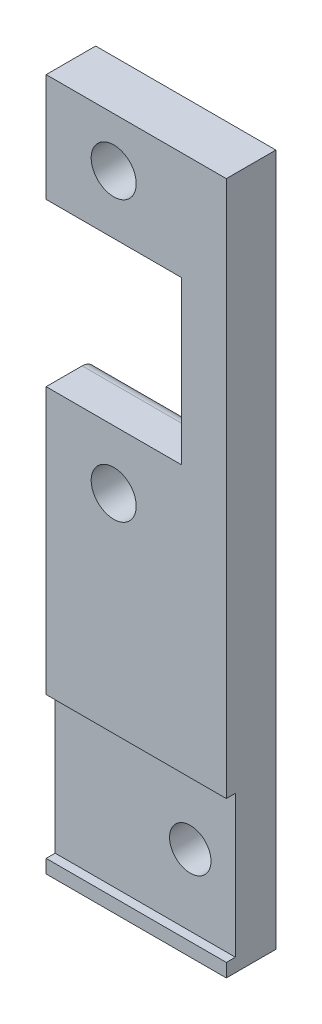
ISO-10303-21;
HEADER;
FILE_DESCRIPTION(('STEP AP214'),'2;1');
FILE_NAME('part.step','',(''),(''),'','','');
FILE_SCHEMA(('AUTOMOTIVE_DESIGN { 1 0 10303 214 1 1 1 1 }'));
ENDSEC;
DATA;
#1=APPLICATION_CONTEXT('core data for automotive mechanical design processes');
#2=APPLICATION_PROTOCOL_DEFINITION('international standard','automotive_design',2000,#1);
#3=PRODUCT_CONTEXT('',#1,'mechanical');
#4=PRODUCT('Part','Part','',(#3));
#5=PRODUCT_RELATED_PRODUCT_CATEGORY('part','',(#4));
#6=PRODUCT_DEFINITION_FORMATION('','',#4);
#7=PRODUCT_DEFINITION_CONTEXT('part definition',#1,'design');
#8=PRODUCT_DEFINITION('design','',#6,#7);
#9=PRODUCT_DEFINITION_SHAPE('','',#8);
#10=(LENGTH_UNIT() NAMED_UNIT(*) SI_UNIT(.MILLI.,.METRE.));
#11=(NAMED_UNIT(*) PLANE_ANGLE_UNIT() SI_UNIT($,.RADIAN.));
#12=(NAMED_UNIT(*) SI_UNIT($,.STERADIAN.) SOLID_ANGLE_UNIT());
#13=UNCERTAINTY_MEASURE_WITH_UNIT(LENGTH_MEASURE(1.E-05),#10,'distance_accuracy_value','');
#14=(GEOMETRIC_REPRESENTATION_CONTEXT(3) GLOBAL_UNCERTAINTY_ASSIGNED_CONTEXT((#13)) GLOBAL_UNIT_ASSIGNED_CONTEXT((#10,
#11,#12)) REPRESENTATION_CONTEXT('',''));
#15=CARTESIAN_POINT('',(0.,0.,0.));
#16=DIRECTION('',(0.,0.,1.));
#17=DIRECTION('',(1.,0.,0.));
#18=AXIS2_PLACEMENT_3D('',#15,#16,#17);
#19=CARTESIAN_POINT('',(0.,0.,5.5));
#20=DIRECTION('',(0.,0.,-1.));
#21=DIRECTION('',(-1.,0.,0.));
#22=AXIS2_PLACEMENT_3D('',#19,#20,#21);
#23=PLANE('',#22);
#24=CARTESIAN_POINT('',(7.5,71.35,5.5));
#25=DIRECTION('',(0.,0.,1.));
#26=DIRECTION('',(1.,0.,0.));
#27=AXIS2_PLACEMENT_3D('',#24,#25,#26);
#28=CIRCLE('',#27,2.5);
#29=CARTESIAN_POINT('',(10.,71.35,5.5));
#30=VERTEX_POINT('',#29);
#31=EDGE_CURVE('E175',#30,#30,#28,.T.);
#32=ORIENTED_EDGE('',*,*,#31,.F.);
#33=EDGE_LOOP('',(#32));
#34=FACE_BOUND('',#33,.T.);
#35=CARTESIAN_POINT('',(7.5,40.35,5.5));
#36=DIRECTION('',(0.,0.,1.));
#37=DIRECTION('',(1.,0.,0.));
#38=AXIS2_PLACEMENT_3D('',#35,#36,#37);
#39=CIRCLE('',#38,2.5);
#40=CARTESIAN_POINT('',(10.,40.35,5.5));
#41=VERTEX_POINT('',#40);
#42=EDGE_CURVE('E181',#41,#41,#39,.T.);
#43=ORIENTED_EDGE('',*,*,#42,.F.);
#44=EDGE_LOOP('',(#43));
#45=FACE_BOUND('',#44,.T.);
#46=DIRECTION('',(0.,-1.,0.));
#47=VECTOR('',#46,1.);
#48=CARTESIAN_POINT('',(0.,0.,5.5));
#49=LINE('',#48,#47);
#50=CARTESIAN_POINT('',(0.,46.85,5.5));
#51=VERTEX_POINT('',#50);
#52=CARTESIAN_POINT('',(0.,17.25,5.5));
#53=VERTEX_POINT('',#52);
#54=EDGE_CURVE('E187',#51,#53,#49,.T.);
#55=ORIENTED_EDGE('',*,*,#54,.T.);
#56=DIRECTION('',(-1.,0.,0.));
#57=VECTOR('',#56,1.);
#58=CARTESIAN_POINT('',(0.,17.25,5.5));
#59=LINE('',#58,#57);
#60=CARTESIAN_POINT('',(20.,17.25,5.5));
#61=VERTEX_POINT('',#60);
#62=EDGE_CURVE('E159',#61,#53,#59,.T.);
#63=ORIENTED_EDGE('',*,*,#62,.F.);
#64=DIRECTION('',(0.,1.,0.));
#65=VECTOR('',#64,1.);
#66=CARTESIAN_POINT('',(20.,0.,5.5));
#67=LINE('',#66,#65);
#68=CARTESIAN_POINT('',(20.,76.85,5.5));
#69=VERTEX_POINT('',#68);
#70=EDGE_CURVE('E192',#61,#69,#67,.T.);
#71=ORIENTED_EDGE('',*,*,#70,.T.);
#72=DIRECTION('',(-1.,0.,0.));
#73=VECTOR('',#72,1.);
#74=CARTESIAN_POINT('',(0.,76.85,5.5));
#75=LINE('',#74,#73);
#76=CARTESIAN_POINT('',(0.,76.85,5.5));
#77=VERTEX_POINT('',#76);
#78=EDGE_CURVE('E196',#69,#77,#75,.T.);
#79=ORIENTED_EDGE('',*,*,#78,.T.);
#80=DIRECTION('',(0.,-1.,0.));
#81=VECTOR('',#80,1.);
#82=CARTESIAN_POINT('',(0.,64.85,5.5));
#83=LINE('',#82,#81);
#84=CARTESIAN_POINT('',(0.,64.85,5.5));
#85=VERTEX_POINT('',#84);
#86=EDGE_CURVE('E198',#77,#85,#83,.T.);
#87=ORIENTED_EDGE('',*,*,#86,.T.);
#88=DIRECTION('',(1.,0.,0.));
#89=VECTOR('',#88,1.);
#90=CARTESIAN_POINT('',(15.,64.85,5.5));
#91=LINE('',#90,#89);
#92=CARTESIAN_POINT('',(15.,64.85,5.5));
#93=VERTEX_POINT('',#92);
#94=EDGE_CURVE('E200',#85,#93,#91,.T.);
#95=ORIENTED_EDGE('',*,*,#94,.T.);
#96=DIRECTION('',(0.,-1.,0.));
#97=VECTOR('',#96,1.);
#98=CARTESIAN_POINT('',(15.,46.85,5.5));
#99=LINE('',#98,#97);
#100=CARTESIAN_POINT('',(15.,46.85,5.5));
#101=VERTEX_POINT('',#100);
#102=EDGE_CURVE('E202',#93,#101,#99,.T.);
#103=ORIENTED_EDGE('',*,*,#102,.T.);
#104=DIRECTION('',(-1.,0.,0.));
#105=VECTOR('',#104,1.);
#106=CARTESIAN_POINT('',(0.,46.85,5.5));
#107=LINE('',#106,#105);
#108=EDGE_CURVE('E204',#101,#51,#107,.T.);
#109=ORIENTED_EDGE('',*,*,#108,.T.);
#110=EDGE_LOOP('',(#55,#63,#71,#79,#87,#95,#103,#109));
#111=FACE_BOUND('',#110,.T.);
#112=ADVANCED_FACE('F40',(#34,#45,#111),#23,.F.);
#113=CARTESIAN_POINT('',(20.,0.,5.5));
#114=VERTEX_POINT('',#113);
#115=CARTESIAN_POINT('',(20.,1.5,5.5));
#116=VERTEX_POINT('',#115);
#117=EDGE_CURVE('E193',#114,#116,#67,.T.);
#118=ORIENTED_EDGE('',*,*,#117,.T.);
#119=DIRECTION('',(1.,0.,0.));
#120=VECTOR('',#119,1.);
#121=CARTESIAN_POINT('',(0.,1.5,5.5));
#122=LINE('',#121,#120);
#123=CARTESIAN_POINT('',(0.,1.5,5.5));
#124=VERTEX_POINT('',#123);
#125=EDGE_CURVE('E282',#124,#116,#122,.T.);
#126=ORIENTED_EDGE('',*,*,#125,.F.);
#127=CARTESIAN_POINT('',(0.,0.,5.5));
#128=VERTEX_POINT('',#127);
#129=EDGE_CURVE('E164',#124,#128,#49,.T.);
#130=ORIENTED_EDGE('',*,*,#129,.T.);
#131=DIRECTION('',(1.,0.,0.));
#132=VECTOR('',#131,1.);
#133=CARTESIAN_POINT('',(0.,0.,5.5));
#134=LINE('',#133,#132);
#135=EDGE_CURVE('E190',#128,#114,#134,.T.);
#136=ORIENTED_EDGE('',*,*,#135,.T.);
#137=EDGE_LOOP('',(#118,#126,#130,#136));
#138=FACE_BOUND('',#137,.T.);
#139=ADVANCED_FACE('F281',(#138),#23,.F.);
#140=CARTESIAN_POINT('',(0.,0.,0.));
#141=DIRECTION('',(0.,0.,-1.));
#142=DIRECTION('',(-1.,0.,0.));
#143=AXIS2_PLACEMENT_3D('',#140,#141,#142);
#144=PLANE('',#143);
#145=CARTESIAN_POINT('',(7.5,71.35,0.));
#146=DIRECTION('',(0.,0.,1.));
#147=DIRECTION('',(1.,0.,0.));
#148=AXIS2_PLACEMENT_3D('',#145,#146,#147);
#149=CIRCLE('',#148,2.5);
#150=CARTESIAN_POINT('',(10.,71.35,0.));
#151=VERTEX_POINT('',#150);
#152=EDGE_CURVE('E174',#151,#151,#149,.T.);
#153=ORIENTED_EDGE('',*,*,#152,.T.);
#154=EDGE_LOOP('',(#153));
#155=FACE_BOUND('',#154,.T.);
#156=DIRECTION('',(0.,-1.,0.));
#157=VECTOR('',#156,1.);
#158=CARTESIAN_POINT('',(0.,0.,0.));
#159=LINE('',#158,#157);
#160=CARTESIAN_POINT('',(0.,45.35,0.));
#161=VERTEX_POINT('',#160);
#162=CARTESIAN_POINT('',(0.,0.,0.));
#163=VERTEX_POINT('',#162);
#164=EDGE_CURVE('E184',#161,#163,#159,.T.);
#165=ORIENTED_EDGE('',*,*,#164,.F.);
#166=DIRECTION('',(-1.,0.,0.));
#167=VECTOR('',#166,1.);
#168=CARTESIAN_POINT('',(15.,45.35,0.));
#169=LINE('',#168,#167);
#170=CARTESIAN_POINT('',(15.,45.35,0.));
#171=VERTEX_POINT('',#170);
#172=EDGE_CURVE('E247',#161,#171,#169,.F.);
#173=ORIENTED_EDGE('',*,*,#172,.T.);
#174=DIRECTION('',(0.,-1.,0.));
#175=VECTOR('',#174,1.);
#176=CARTESIAN_POINT('',(15.,46.85,0.));
#177=LINE('',#176,#175);
#178=CARTESIAN_POINT('',(15.,66.35,0.));
#179=VERTEX_POINT('',#178);
#180=EDGE_CURVE('E216',#179,#171,#177,.T.);
#181=ORIENTED_EDGE('',*,*,#180,.F.);
#182=DIRECTION('',(1.,0.,0.));
#183=VECTOR('',#182,1.);
#184=CARTESIAN_POINT('',(0.,66.35,0.));
#185=LINE('',#184,#183);
#186=CARTESIAN_POINT('',(0.,66.35,0.));
#187=VERTEX_POINT('',#186);
#188=EDGE_CURVE('E245',#179,#187,#185,.F.);
#189=ORIENTED_EDGE('',*,*,#188,.T.);
#190=DIRECTION('',(0.,-1.,0.));
#191=VECTOR('',#190,1.);
#192=CARTESIAN_POINT('',(0.,64.85,0.));
#193=LINE('',#192,#191);
#194=CARTESIAN_POINT('',(0.,76.85,0.));
#195=VERTEX_POINT('',#194);
#196=EDGE_CURVE('E214',#195,#187,#193,.T.);
#197=ORIENTED_EDGE('',*,*,#196,.F.);
#198=DIRECTION('',(-1.,0.,0.));
#199=VECTOR('',#198,1.);
#200=CARTESIAN_POINT('',(0.,76.85,0.));
#201=LINE('',#200,#199);
#202=CARTESIAN_POINT('',(20.,76.85,0.));
#203=VERTEX_POINT('',#202);
#204=EDGE_CURVE('E212',#203,#195,#201,.T.);
#205=ORIENTED_EDGE('',*,*,#204,.F.);
#206=DIRECTION('',(0.,1.,0.));
#207=VECTOR('',#206,1.);
#208=CARTESIAN_POINT('',(20.,0.,0.));
#209=LINE('',#208,#207);
#210=CARTESIAN_POINT('',(20.,0.,0.));
#211=VERTEX_POINT('',#210);
#212=EDGE_CURVE('E210',#211,#203,#209,.T.);
#213=ORIENTED_EDGE('',*,*,#212,.F.);
#214=DIRECTION('',(1.,0.,0.));
#215=VECTOR('',#214,1.);
#216=CARTESIAN_POINT('',(0.,0.,0.));
#217=LINE('',#216,#215);
#218=EDGE_CURVE('E208',#163,#211,#217,.T.);
#219=ORIENTED_EDGE('',*,*,#218,.F.);
#220=EDGE_LOOP('',(#165,#173,#181,#189,#197,#205,#213,#219));
#221=FACE_BOUND('',#220,.T.);
#222=CARTESIAN_POINT('',(7.5,40.35,0.));
#223=DIRECTION('',(0.,0.,1.));
#224=DIRECTION('',(1.,0.,0.));
#225=AXIS2_PLACEMENT_3D('',#222,#223,#224);
#226=CIRCLE('',#225,2.5);
#227=CARTESIAN_POINT('',(10.,40.35,0.));
#228=VERTEX_POINT('',#227);
#229=EDGE_CURVE('E178',#228,#228,#226,.T.);
#230=ORIENTED_EDGE('',*,*,#229,.T.);
#231=EDGE_LOOP('',(#230));
#232=FACE_BOUND('',#231,.T.);
#233=CARTESIAN_POINT('',(15.,9.375,0.));
#234=DIRECTION('',(0.,0.,1.));
#235=DIRECTION('',(1.,0.,0.));
#236=AXIS2_PLACEMENT_3D('',#233,#234,#235);
#237=CIRCLE('',#236,2.3);
#238=CARTESIAN_POINT('',(17.3,9.375,0.));
#239=VERTEX_POINT('',#238);
#240=EDGE_CURVE('E171',#239,#239,#237,.T.);
#241=ORIENTED_EDGE('',*,*,#240,.T.);
#242=EDGE_LOOP('',(#241));
#243=FACE_BOUND('',#242,.T.);
#244=ADVANCED_FACE('F271',(#155,#221,#232,#243),#144,.T.);
#245=CARTESIAN_POINT('',(0.,0.,5.5));
#246=DIRECTION('',(1.,0.,0.));
#247=DIRECTION('',(0.,0.,-1.));
#248=AXIS2_PLACEMENT_3D('',#245,#246,#247);
#249=PLANE('',#248);
#250=DIRECTION('',(0.,-1.,0.));
#251=VECTOR('',#250,1.);
#252=CARTESIAN_POINT('',(0.,1.5,4.5));
#253=LINE('',#252,#251);
#254=CARTESIAN_POINT('',(0.,17.25,4.5));
#255=VERTEX_POINT('',#254);
#256=CARTESIAN_POINT('',(0.,1.5,4.5));
#257=VERTEX_POINT('',#256);
#258=EDGE_CURVE('E150',#255,#257,#253,.T.);
#259=ORIENTED_EDGE('',*,*,#258,.F.);
#260=DIRECTION('',(0.,0.,1.));
#261=VECTOR('',#260,1.);
#262=CARTESIAN_POINT('',(0.,17.25,4.5));
#263=LINE('',#262,#261);
#264=EDGE_CURVE('E287',#255,#53,#263,.T.);
#265=ORIENTED_EDGE('',*,*,#264,.T.);
#266=ORIENTED_EDGE('',*,*,#54,.F.);
#267=DIRECTION('',(0.,0.,-1.));
#268=VECTOR('',#267,1.);
#269=CARTESIAN_POINT('',(0.,46.85,5.5));
#270=LINE('',#269,#268);
#271=CARTESIAN_POINT('',(0.,46.85,1.5));
#272=VERTEX_POINT('',#271);
#273=EDGE_CURVE('E206',#51,#272,#270,.T.);
#274=ORIENTED_EDGE('',*,*,#273,.T.);
#275=CARTESIAN_POINT('',(0.,45.35,1.5));
#276=DIRECTION('',(1.,0.,0.));
#277=DIRECTION('',(0.,0.,-1.));
#278=AXIS2_PLACEMENT_3D('',#275,#276,#277);
#279=CIRCLE('',#278,1.5);
#280=EDGE_CURVE('E243',#272,#161,#279,.F.);
#281=ORIENTED_EDGE('',*,*,#280,.T.);
#282=ORIENTED_EDGE('',*,*,#164,.T.);
#283=DIRECTION('',(0.,0.,-1.));
#284=VECTOR('',#283,1.);
#285=CARTESIAN_POINT('',(0.,0.,5.5));
#286=LINE('',#285,#284);
#287=EDGE_CURVE('E237',#128,#163,#286,.T.);
#288=ORIENTED_EDGE('',*,*,#287,.F.);
#289=ORIENTED_EDGE('',*,*,#129,.F.);
#290=DIRECTION('',(0.,0.,1.));
#291=VECTOR('',#290,1.);
#292=CARTESIAN_POINT('',(0.,1.5,4.5));
#293=LINE('',#292,#291);
#294=EDGE_CURVE('E144',#257,#124,#293,.T.);
#295=ORIENTED_EDGE('',*,*,#294,.F.);
#296=EDGE_LOOP('',(#259,#265,#266,#274,#281,#282,#288,#289,#295));
#297=FACE_BOUND('',#296,.T.);
#298=ADVANCED_FACE('F162',(#297),#249,.F.);
#299=CARTESIAN_POINT('',(0.,0.,5.5));
#300=DIRECTION('',(0.,1.,0.));
#301=DIRECTION('',(0.,0.,1.));
#302=AXIS2_PLACEMENT_3D('',#299,#300,#301);
#303=PLANE('',#302);
#304=ORIENTED_EDGE('',*,*,#218,.T.);
#305=DIRECTION('',(0.,0.,-1.));
#306=VECTOR('',#305,1.);
#307=CARTESIAN_POINT('',(20.,0.,5.5));
#308=LINE('',#307,#306);
#309=EDGE_CURVE('E234',#114,#211,#308,.T.);
#310=ORIENTED_EDGE('',*,*,#309,.F.);
#311=ORIENTED_EDGE('',*,*,#135,.F.);
#312=ORIENTED_EDGE('',*,*,#287,.T.);
#313=EDGE_LOOP('',(#304,#310,#311,#312));
#314=FACE_BOUND('',#313,.T.);
#315=ADVANCED_FACE('F278',(#314),#303,.F.);
#316=CARTESIAN_POINT('',(20.,0.,5.5));
#317=DIRECTION('',(-1.,0.,0.));
#318=DIRECTION('',(0.,0.,1.));
#319=AXIS2_PLACEMENT_3D('',#316,#317,#318);
#320=PLANE('',#319);
#321=ORIENTED_EDGE('',*,*,#70,.F.);
#322=DIRECTION('',(0.,0.,1.));
#323=VECTOR('',#322,1.);
#324=CARTESIAN_POINT('',(20.,17.25,4.5));
#325=LINE('',#324,#323);
#326=CARTESIAN_POINT('',(20.,17.25,4.5));
#327=VERTEX_POINT('',#326);
#328=EDGE_CURVE('E166',#327,#61,#325,.T.);
#329=ORIENTED_EDGE('',*,*,#328,.F.);
#330=DIRECTION('',(0.,1.,0.));
#331=VECTOR('',#330,1.);
#332=CARTESIAN_POINT('',(20.,1.5,4.5));
#333=LINE('',#332,#331);
#334=CARTESIAN_POINT('',(20.,1.5,4.5));
#335=VERTEX_POINT('',#334);
#336=EDGE_CURVE('E149',#335,#327,#333,.T.);
#337=ORIENTED_EDGE('',*,*,#336,.F.);
#338=DIRECTION('',(0.,0.,1.));
#339=VECTOR('',#338,1.);
#340=CARTESIAN_POINT('',(20.,1.5,4.5));
#341=LINE('',#340,#339);
#342=EDGE_CURVE('E147',#335,#116,#341,.T.);
#343=ORIENTED_EDGE('',*,*,#342,.T.);
#344=ORIENTED_EDGE('',*,*,#117,.F.);
#345=ORIENTED_EDGE('',*,*,#309,.T.);
#346=ORIENTED_EDGE('',*,*,#212,.T.);
#347=DIRECTION('',(0.,0.,-1.));
#348=VECTOR('',#347,1.);
#349=CARTESIAN_POINT('',(20.,76.85,5.5));
#350=LINE('',#349,#348);
#351=EDGE_CURVE('E231',#69,#203,#350,.T.);
#352=ORIENTED_EDGE('',*,*,#351,.F.);
#353=EDGE_LOOP('',(#321,#329,#337,#343,#344,#345,#346,#352));
#354=FACE_BOUND('',#353,.T.);
#355=ADVANCED_FACE('F296',(#354),#320,.F.);
#356=CARTESIAN_POINT('',(0.,76.85,5.5));
#357=DIRECTION('',(0.,-1.,0.));
#358=DIRECTION('',(0.,0.,-1.));
#359=AXIS2_PLACEMENT_3D('',#356,#357,#358);
#360=PLANE('',#359);
#361=ORIENTED_EDGE('',*,*,#204,.T.);
#362=DIRECTION('',(0.,0.,-1.));
#363=VECTOR('',#362,1.);
#364=CARTESIAN_POINT('',(0.,76.85,5.5));
#365=LINE('',#364,#363);
#366=EDGE_CURVE('E228',#77,#195,#365,.T.);
#367=ORIENTED_EDGE('',*,*,#366,.F.);
#368=ORIENTED_EDGE('',*,*,#78,.F.);
#369=ORIENTED_EDGE('',*,*,#351,.T.);
#370=EDGE_LOOP('',(#361,#367,#368,#369));
#371=FACE_BOUND('',#370,.T.);
#372=ADVANCED_FACE('F300',(#371),#360,.F.);
#373=CARTESIAN_POINT('',(0.,64.85,5.5));
#374=DIRECTION('',(1.,0.,0.));
#375=DIRECTION('',(0.,0.,-1.));
#376=AXIS2_PLACEMENT_3D('',#373,#374,#375);
#377=PLANE('',#376);
#378=ORIENTED_EDGE('',*,*,#196,.T.);
#379=CARTESIAN_POINT('',(0.,66.35,1.5));
#380=DIRECTION('',(1.,0.,0.));
#381=DIRECTION('',(0.,0.,-1.));
#382=AXIS2_PLACEMENT_3D('',#379,#380,#381);
#383=CIRCLE('',#382,1.5);
#384=CARTESIAN_POINT('',(0.,64.85,1.5));
#385=VERTEX_POINT('',#384);
#386=EDGE_CURVE('E64',#187,#385,#383,.F.);
#387=ORIENTED_EDGE('',*,*,#386,.T.);
#388=DIRECTION('',(0.,0.,-1.));
#389=VECTOR('',#388,1.);
#390=CARTESIAN_POINT('',(0.,64.85,5.5));
#391=LINE('',#390,#389);
#392=EDGE_CURVE('E226',#85,#385,#391,.T.);
#393=ORIENTED_EDGE('',*,*,#392,.F.);
#394=ORIENTED_EDGE('',*,*,#86,.F.);
#395=ORIENTED_EDGE('',*,*,#366,.T.);
#396=EDGE_LOOP('',(#378,#387,#393,#394,#395));
#397=FACE_BOUND('',#396,.T.);
#398=ADVANCED_FACE('F304',(#397),#377,.F.);
#399=CARTESIAN_POINT('',(15.,64.85,5.5));
#400=DIRECTION('',(0.,1.,0.));
#401=DIRECTION('',(0.,0.,1.));
#402=AXIS2_PLACEMENT_3D('',#399,#400,#401);
#403=PLANE('',#402);
#404=ORIENTED_EDGE('',*,*,#392,.T.);
#405=DIRECTION('',(1.,0.,0.));
#406=VECTOR('',#405,1.);
#407=CARTESIAN_POINT('',(15.,64.85,1.5));
#408=LINE('',#407,#406);
#409=CARTESIAN_POINT('',(15.,64.85,1.5));
#410=VERTEX_POINT('',#409);
#411=EDGE_CURVE('E250',#385,#410,#408,.T.);
#412=ORIENTED_EDGE('',*,*,#411,.T.);
#413=DIRECTION('',(0.,0.,-1.));
#414=VECTOR('',#413,1.);
#415=CARTESIAN_POINT('',(15.,64.85,5.5));
#416=LINE('',#415,#414);
#417=EDGE_CURVE('E223',#93,#410,#416,.T.);
#418=ORIENTED_EDGE('',*,*,#417,.F.);
#419=ORIENTED_EDGE('',*,*,#94,.F.);
#420=EDGE_LOOP('',(#404,#412,#418,#419));
#421=FACE_BOUND('',#420,.T.);
#422=ADVANCED_FACE('F307',(#421),#403,.F.);
#423=CARTESIAN_POINT('',(15.,46.85,5.5));
#424=DIRECTION('',(1.,0.,0.));
#425=DIRECTION('',(0.,1.,0.));
#426=AXIS2_PLACEMENT_3D('',#423,#424,#425);
#427=PLANE('',#426);
#428=ORIENTED_EDGE('',*,*,#180,.T.);
#429=CARTESIAN_POINT('',(15.,45.35,1.5));
#430=DIRECTION('',(1.,0.,0.));
#431=DIRECTION('',(0.,1.,0.));
#432=AXIS2_PLACEMENT_3D('',#429,#430,#431);
#433=CIRCLE('',#432,1.5);
#434=CARTESIAN_POINT('',(15.,46.85,1.5));
#435=VERTEX_POINT('',#434);
#436=EDGE_CURVE('E49',#171,#435,#433,.T.);
#437=ORIENTED_EDGE('',*,*,#436,.T.);
#438=DIRECTION('',(0.,0.,-1.));
#439=VECTOR('',#438,1.);
#440=CARTESIAN_POINT('',(15.,46.85,5.5));
#441=LINE('',#440,#439);
#442=EDGE_CURVE('E220',#101,#435,#441,.T.);
#443=ORIENTED_EDGE('',*,*,#442,.F.);
#444=ORIENTED_EDGE('',*,*,#102,.F.);
#445=ORIENTED_EDGE('',*,*,#417,.T.);
#446=CARTESIAN_POINT('',(15.,66.35,1.5));
#447=DIRECTION('',(1.,0.,0.));
#448=DIRECTION('',(0.,1.,0.));
#449=AXIS2_PLACEMENT_3D('',#446,#447,#448);
#450=CIRCLE('',#449,1.5);
#451=EDGE_CURVE('E11',#410,#179,#450,.T.);
#452=ORIENTED_EDGE('',*,*,#451,.T.);
#453=EDGE_LOOP('',(#428,#437,#443,#444,#445,#452));
#454=FACE_BOUND('',#453,.T.);
#455=ADVANCED_FACE('F257',(#454),#427,.F.);
#456=CARTESIAN_POINT('',(0.,46.85,5.5));
#457=DIRECTION('',(0.,-1.,0.));
#458=DIRECTION('',(0.,0.,-1.));
#459=AXIS2_PLACEMENT_3D('',#456,#457,#458);
#460=PLANE('',#459);
#461=ORIENTED_EDGE('',*,*,#442,.T.);
#462=DIRECTION('',(-1.,0.,0.));
#463=VECTOR('',#462,1.);
#464=CARTESIAN_POINT('',(0.,46.85,1.5));
#465=LINE('',#464,#463);
#466=EDGE_CURVE('E240',#435,#272,#465,.T.);
#467=ORIENTED_EDGE('',*,*,#466,.T.);
#468=ORIENTED_EDGE('',*,*,#273,.F.);
#469=ORIENTED_EDGE('',*,*,#108,.F.);
#470=EDGE_LOOP('',(#461,#467,#468,#469));
#471=FACE_BOUND('',#470,.T.);
#472=ADVANCED_FACE('F264',(#471),#460,.F.);
#473=CARTESIAN_POINT('',(7.5,40.35,5.5));
#474=DIRECTION('',(0.,0.,-1.));
#475=DIRECTION('',(-1.,0.,0.));
#476=AXIS2_PLACEMENT_3D('',#473,#474,#475);
#477=CYLINDRICAL_SURFACE('',#476,2.5);
#478=ORIENTED_EDGE('',*,*,#42,.T.);
#479=EDGE_LOOP('',(#478));
#480=FACE_BOUND('',#479,.T.);
#481=ORIENTED_EDGE('',*,*,#229,.F.);
#482=EDGE_LOOP('',(#481));
#483=FACE_BOUND('',#482,.T.);
#484=ADVANCED_FACE('F328',(#480,#483),#477,.F.);
#485=CARTESIAN_POINT('',(7.5,71.35,5.5));
#486=DIRECTION('',(0.,0.,-1.));
#487=DIRECTION('',(-1.,0.,0.));
#488=AXIS2_PLACEMENT_3D('',#485,#486,#487);
#489=CYLINDRICAL_SURFACE('',#488,2.5);
#490=ORIENTED_EDGE('',*,*,#31,.T.);
#491=EDGE_LOOP('',(#490));
#492=FACE_BOUND('',#491,.T.);
#493=ORIENTED_EDGE('',*,*,#152,.F.);
#494=EDGE_LOOP('',(#493));
#495=FACE_BOUND('',#494,.T.);
#496=ADVANCED_FACE('F366',(#492,#495),#489,.F.);
#497=CARTESIAN_POINT('',(15.,9.375,5.5));
#498=DIRECTION('',(0.,0.,-1.));
#499=DIRECTION('',(-1.,0.,0.));
#500=AXIS2_PLACEMENT_3D('',#497,#498,#499);
#501=CYLINDRICAL_SURFACE('',#500,2.3);
#502=CARTESIAN_POINT('',(15.,9.375,4.5));
#503=DIRECTION('',(0.,0.,-1.));
#504=DIRECTION('',(-1.,0.,0.));
#505=AXIS2_PLACEMENT_3D('',#502,#503,#504);
#506=CIRCLE('',#505,2.3);
#507=CARTESIAN_POINT('',(12.7,9.375,4.5));
#508=VERTEX_POINT('',#507);
#509=EDGE_CURVE('E44',#508,#508,#506,.T.);
#510=ORIENTED_EDGE('',*,*,#509,.F.);
#511=EDGE_LOOP('',(#510));
#512=FACE_BOUND('',#511,.T.);
#513=ORIENTED_EDGE('',*,*,#240,.F.);
#514=EDGE_LOOP('',(#513));
#515=FACE_BOUND('',#514,.T.);
#516=ADVANCED_FACE('F318',(#512,#515),#501,.F.);
#517=CARTESIAN_POINT('',(0.,45.35,1.5));
#518=DIRECTION('',(1.,0.,0.));
#519=DIRECTION('',(0.,0.,-1.));
#520=AXIS2_PLACEMENT_3D('',#517,#518,#519);
#521=CYLINDRICAL_SURFACE('',#520,1.5);
#522=ORIENTED_EDGE('',*,*,#436,.F.);
#523=ORIENTED_EDGE('',*,*,#172,.F.);
#524=ORIENTED_EDGE('',*,*,#280,.F.);
#525=ORIENTED_EDGE('',*,*,#466,.F.);
#526=EDGE_LOOP('',(#522,#523,#524,#525));
#527=FACE_BOUND('',#526,.T.);
#528=ADVANCED_FACE('F266',(#527),#521,.T.);
#529=CARTESIAN_POINT('',(15.,66.35,1.5));
#530=DIRECTION('',(-1.,0.,0.));
#531=DIRECTION('',(0.,0.,1.));
#532=AXIS2_PLACEMENT_3D('',#529,#530,#531);
#533=CYLINDRICAL_SURFACE('',#532,1.5);
#534=ORIENTED_EDGE('',*,*,#386,.F.);
#535=ORIENTED_EDGE('',*,*,#188,.F.);
#536=ORIENTED_EDGE('',*,*,#451,.F.);
#537=ORIENTED_EDGE('',*,*,#411,.F.);
#538=EDGE_LOOP('',(#534,#535,#536,#537));
#539=FACE_BOUND('',#538,.T.);
#540=ADVANCED_FACE('F42',(#539),#533,.T.);
#541=CARTESIAN_POINT('',(0.,17.25,4.5));
#542=DIRECTION('',(0.,1.,0.));
#543=DIRECTION('',(0.,0.,1.));
#544=AXIS2_PLACEMENT_3D('',#541,#542,#543);
#545=PLANE('',#544);
#546=ORIENTED_EDGE('',*,*,#62,.T.);
#547=ORIENTED_EDGE('',*,*,#264,.F.);
#548=DIRECTION('',(-1.,0.,0.));
#549=VECTOR('',#548,1.);
#550=CARTESIAN_POINT('',(0.,17.25,4.5));
#551=LINE('',#550,#549);
#552=EDGE_CURVE('E156',#327,#255,#551,.T.);
#553=ORIENTED_EDGE('',*,*,#552,.F.);
#554=ORIENTED_EDGE('',*,*,#328,.T.);
#555=EDGE_LOOP('',(#546,#547,#553,#554));
#556=FACE_BOUND('',#555,.T.);
#557=ADVANCED_FACE('F291',(#556),#545,.F.);
#558=CARTESIAN_POINT('',(0.,1.5,4.5));
#559=DIRECTION('',(0.,-1.,0.));
#560=DIRECTION('',(1.,0.,0.));
#561=AXIS2_PLACEMENT_3D('',#558,#559,#560);
#562=PLANE('',#561);
#563=ORIENTED_EDGE('',*,*,#125,.T.);
#564=ORIENTED_EDGE('',*,*,#342,.F.);
#565=DIRECTION('',(1.,0.,0.));
#566=VECTOR('',#565,1.);
#567=CARTESIAN_POINT('',(0.,1.5,4.5));
#568=LINE('',#567,#566);
#569=EDGE_CURVE('E56',#257,#335,#568,.T.);
#570=ORIENTED_EDGE('',*,*,#569,.F.);
#571=ORIENTED_EDGE('',*,*,#294,.T.);
#572=EDGE_LOOP('',(#563,#564,#570,#571));
#573=FACE_BOUND('',#572,.T.);
#574=ADVANCED_FACE('F142',(#573),#562,.F.);
#575=CARTESIAN_POINT('',(0.,0.,4.5));
#576=DIRECTION('',(0.,0.,-1.));
#577=DIRECTION('',(-1.,0.,0.));
#578=AXIS2_PLACEMENT_3D('',#575,#576,#577);
#579=PLANE('',#578);
#580=ORIENTED_EDGE('',*,*,#509,.T.);
#581=EDGE_LOOP('',(#580));
#582=FACE_BOUND('',#581,.T.);
#583=ORIENTED_EDGE('',*,*,#258,.T.);
#584=ORIENTED_EDGE('',*,*,#569,.T.);
#585=ORIENTED_EDGE('',*,*,#336,.T.);
#586=ORIENTED_EDGE('',*,*,#552,.T.);
#587=EDGE_LOOP('',(#583,#584,#585,#586));
#588=FACE_BOUND('',#587,.T.);
#589=ADVANCED_FACE('F154',(#582,#588),#579,.F.);
#590=CLOSED_SHELL('',(#112,#139,#244,#298,#315,#355,#372,#398,#422,#455,#472,#484,#496,#516,
#528,#540,#557,#574,#589));
#591=MANIFOLD_SOLID_BREP('B2',#590);
#592=ADVANCED_BREP_SHAPE_REPRESENTATION('',(#18,#591),#14);
#593=SHAPE_DEFINITION_REPRESENTATION(#9,#592);
ENDSEC;
END-ISO-10303-21;
